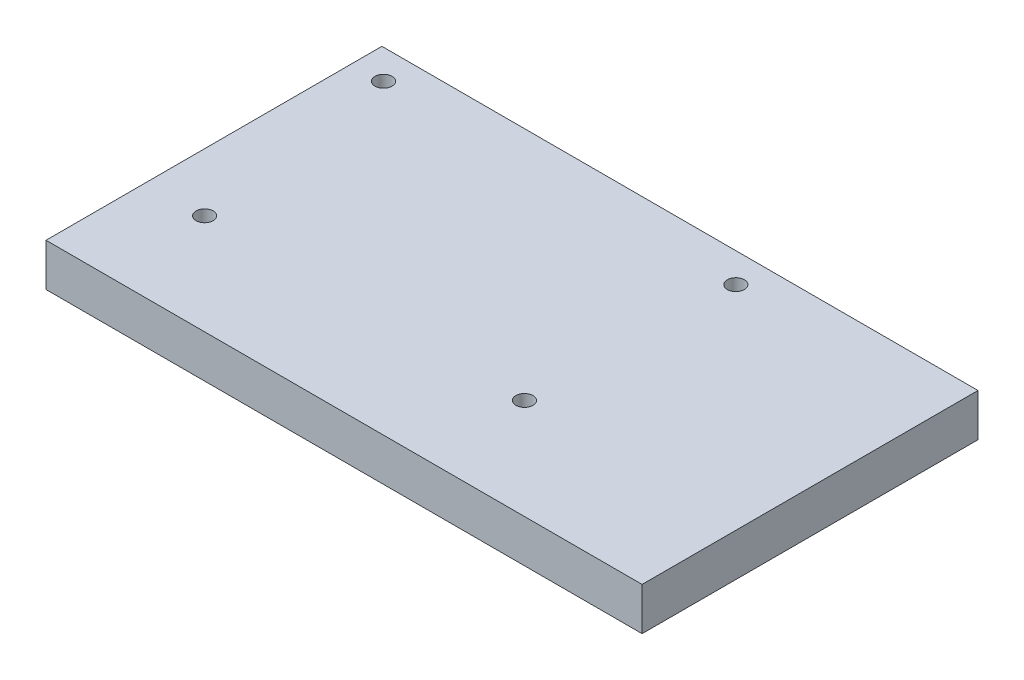
ISO-10303-21;
HEADER;
FILE_DESCRIPTION(('STEP AP214'),'2;1');
FILE_NAME('part.step','',(''),(''),'','','');
FILE_SCHEMA(('AUTOMOTIVE_DESIGN { 1 0 10303 214 1 1 1 1 }'));
ENDSEC;
DATA;
#1=APPLICATION_CONTEXT('core data for automotive mechanical design processes');
#2=APPLICATION_PROTOCOL_DEFINITION('international standard','automotive_design',2000,#1);
#3=PRODUCT_CONTEXT('',#1,'mechanical');
#4=PRODUCT('Part','Part','',(#3));
#5=PRODUCT_RELATED_PRODUCT_CATEGORY('part','',(#4));
#6=PRODUCT_DEFINITION_FORMATION('','',#4);
#7=PRODUCT_DEFINITION_CONTEXT('part definition',#1,'design');
#8=PRODUCT_DEFINITION('design','',#6,#7);
#9=PRODUCT_DEFINITION_SHAPE('','',#8);
#10=(LENGTH_UNIT() NAMED_UNIT(*) SI_UNIT(.MILLI.,.METRE.));
#11=(NAMED_UNIT(*) PLANE_ANGLE_UNIT() SI_UNIT($,.RADIAN.));
#12=(NAMED_UNIT(*) SI_UNIT($,.STERADIAN.) SOLID_ANGLE_UNIT());
#13=UNCERTAINTY_MEASURE_WITH_UNIT(LENGTH_MEASURE(1.E-05),#10,'distance_accuracy_value','');
#14=(GEOMETRIC_REPRESENTATION_CONTEXT(3) GLOBAL_UNCERTAINTY_ASSIGNED_CONTEXT((#13)) GLOBAL_UNIT_ASSIGNED_CONTEXT((#10,
#11,#12)) REPRESENTATION_CONTEXT('',''));
#15=CARTESIAN_POINT('',(0.,0.,0.));
#16=DIRECTION('',(0.,0.,1.));
#17=DIRECTION('',(1.,0.,0.));
#18=AXIS2_PLACEMENT_3D('',#15,#16,#17);
#19=CARTESIAN_POINT('',(0.,10.,0.));
#20=DIRECTION('',(1.,0.,0.));
#21=DIRECTION('',(0.,0.,-1.));
#22=AXIS2_PLACEMENT_3D('',#19,#20,#21);
#23=PLANE('',#22);
#24=DIRECTION('',(0.,0.,1.));
#25=VECTOR('',#24,1.);
#26=CARTESIAN_POINT('',(0.,0.,0.));
#27=LINE('',#26,#25);
#28=CARTESIAN_POINT('',(0.,0.,0.));
#29=VERTEX_POINT('',#28);
#30=CARTESIAN_POINT('',(0.,0.,78.7062484183639));
#31=VERTEX_POINT('',#30);
#32=EDGE_CURVE('E96',#29,#31,#27,.T.);
#33=ORIENTED_EDGE('',*,*,#32,.T.);
#34=DIRECTION('',(0.,-1.,0.));
#35=VECTOR('',#34,1.);
#36=CARTESIAN_POINT('',(0.,10.,78.7062484183639));
#37=LINE('',#36,#35);
#38=CARTESIAN_POINT('',(0.,10.,78.7062484183639));
#39=VERTEX_POINT('',#38);
#40=EDGE_CURVE('E11',#39,#31,#37,.T.);
#41=ORIENTED_EDGE('',*,*,#40,.F.);
#42=DIRECTION('',(0.,0.,1.));
#43=VECTOR('',#42,1.);
#44=CARTESIAN_POINT('',(0.,10.,0.));
#45=LINE('',#44,#43);
#46=CARTESIAN_POINT('',(0.,10.,0.));
#47=VERTEX_POINT('',#46);
#48=EDGE_CURVE('E84',#47,#39,#45,.T.);
#49=ORIENTED_EDGE('',*,*,#48,.F.);
#50=DIRECTION('',(0.,-1.,0.));
#51=VECTOR('',#50,1.);
#52=CARTESIAN_POINT('',(0.,10.,0.));
#53=LINE('',#52,#51);
#54=EDGE_CURVE('E92',#47,#29,#53,.T.);
#55=ORIENTED_EDGE('',*,*,#54,.T.);
#56=EDGE_LOOP('',(#33,#41,#49,#55));
#57=FACE_BOUND('',#56,.T.);
#58=ADVANCED_FACE('F33',(#57),#23,.F.);
#59=CARTESIAN_POINT('',(0.,10.,78.7062484183639));
#60=DIRECTION('',(0.,0.,-1.));
#61=DIRECTION('',(-1.,0.,0.));
#62=AXIS2_PLACEMENT_3D('',#59,#60,#61);
#63=PLANE('',#62);
#64=DIRECTION('',(1.,0.,0.));
#65=VECTOR('',#64,1.);
#66=CARTESIAN_POINT('',(0.,0.,78.7062484183639));
#67=LINE('',#66,#65);
#68=CARTESIAN_POINT('',(139.668592666269,0.,78.7062484183639));
#69=VERTEX_POINT('',#68);
#70=EDGE_CURVE('E88',#31,#69,#67,.T.);
#71=ORIENTED_EDGE('',*,*,#70,.T.);
#72=DIRECTION('',(0.,-1.,0.));
#73=VECTOR('',#72,1.);
#74=CARTESIAN_POINT('',(139.668592666269,10.,78.7062484183639));
#75=LINE('',#74,#73);
#76=CARTESIAN_POINT('',(139.668592666269,10.,78.7062484183639));
#77=VERTEX_POINT('',#76);
#78=EDGE_CURVE('E41',#77,#69,#75,.T.);
#79=ORIENTED_EDGE('',*,*,#78,.F.);
#80=DIRECTION('',(1.,0.,0.));
#81=VECTOR('',#80,1.);
#82=CARTESIAN_POINT('',(0.,10.,78.7062484183639));
#83=LINE('',#82,#81);
#84=EDGE_CURVE('E79',#39,#77,#83,.T.);
#85=ORIENTED_EDGE('',*,*,#84,.F.);
#86=ORIENTED_EDGE('',*,*,#40,.T.);
#87=EDGE_LOOP('',(#71,#79,#85,#86));
#88=FACE_BOUND('',#87,.T.);
#89=ADVANCED_FACE('F87',(#88),#63,.F.);
#90=CARTESIAN_POINT('',(139.668592666269,10.,0.));
#91=DIRECTION('',(-1.,0.,0.));
#92=DIRECTION('',(0.,0.,1.));
#93=AXIS2_PLACEMENT_3D('',#90,#91,#92);
#94=PLANE('',#93);
#95=DIRECTION('',(0.,0.,-1.));
#96=VECTOR('',#95,1.);
#97=CARTESIAN_POINT('',(139.668592666269,0.,0.));
#98=LINE('',#97,#96);
#99=CARTESIAN_POINT('',(139.668592666269,0.,0.));
#100=VERTEX_POINT('',#99);
#101=EDGE_CURVE('E66',#69,#100,#98,.T.);
#102=ORIENTED_EDGE('',*,*,#101,.T.);
#103=DIRECTION('',(0.,-1.,0.));
#104=VECTOR('',#103,1.);
#105=CARTESIAN_POINT('',(139.668592666269,10.,0.));
#106=LINE('',#105,#104);
#107=CARTESIAN_POINT('',(139.668592666269,10.,0.));
#108=VERTEX_POINT('',#107);
#109=EDGE_CURVE('E89',#108,#100,#106,.T.);
#110=ORIENTED_EDGE('',*,*,#109,.F.);
#111=DIRECTION('',(0.,0.,-1.));
#112=VECTOR('',#111,1.);
#113=CARTESIAN_POINT('',(139.668592666269,10.,0.));
#114=LINE('',#113,#112);
#115=EDGE_CURVE('E82',#77,#108,#114,.T.);
#116=ORIENTED_EDGE('',*,*,#115,.F.);
#117=ORIENTED_EDGE('',*,*,#78,.T.);
#118=EDGE_LOOP('',(#102,#110,#116,#117));
#119=FACE_BOUND('',#118,.T.);
#120=ADVANCED_FACE('F90',(#119),#94,.F.);
#121=CARTESIAN_POINT('',(0.,10.,0.));
#122=DIRECTION('',(0.,0.,1.));
#123=DIRECTION('',(1.,0.,0.));
#124=AXIS2_PLACEMENT_3D('',#121,#122,#123);
#125=PLANE('',#124);
#126=DIRECTION('',(-1.,0.,0.));
#127=VECTOR('',#126,1.);
#128=CARTESIAN_POINT('',(0.,0.,0.));
#129=LINE('',#128,#127);
#130=EDGE_CURVE('E72',#100,#29,#129,.T.);
#131=ORIENTED_EDGE('',*,*,#130,.T.);
#132=ORIENTED_EDGE('',*,*,#54,.F.);
#133=DIRECTION('',(-1.,0.,0.));
#134=VECTOR('',#133,1.);
#135=CARTESIAN_POINT('',(0.,10.,0.));
#136=LINE('',#135,#134);
#137=EDGE_CURVE('E49',#108,#47,#136,.T.);
#138=ORIENTED_EDGE('',*,*,#137,.F.);
#139=ORIENTED_EDGE('',*,*,#109,.T.);
#140=EDGE_LOOP('',(#131,#132,#138,#139));
#141=FACE_BOUND('',#140,.T.);
#142=ADVANCED_FACE('F104',(#141),#125,.F.);
#143=CARTESIAN_POINT('',(0.,10.,0.));
#144=DIRECTION('',(0.,1.,0.));
#145=DIRECTION('',(0.,0.,1.));
#146=AXIS2_PLACEMENT_3D('',#143,#144,#145);
#147=PLANE('',#146);
#148=CARTESIAN_POINT('',(7.27646870124331,10.,6.90123816471835));
#149=DIRECTION('',(0.,1.,0.));
#150=DIRECTION('',(0.,0.,1.));
#151=AXIS2_PLACEMENT_3D('',#148,#149,#150);
#152=CIRCLE('',#151,2.);
#153=CARTESIAN_POINT('',(7.27646870124331,10.,8.90123816471834));
#154=VERTEX_POINT('',#153);
#155=EDGE_CURVE('E119',#154,#154,#152,.T.);
#156=ORIENTED_EDGE('',*,*,#155,.F.);
#157=EDGE_LOOP('',(#156));
#158=FACE_BOUND('',#157,.T.);
#159=CARTESIAN_POINT('',(13.6264687012438,10.,55.161238164718));
#160=DIRECTION('',(0.,1.,0.));
#161=DIRECTION('',(0.,0.,1.));
#162=AXIS2_PLACEMENT_3D('',#159,#160,#161);
#163=CIRCLE('',#162,2.00000000000003);
#164=CARTESIAN_POINT('',(13.6264687012438,10.,57.161238164718));
#165=VERTEX_POINT('',#164);
#166=EDGE_CURVE('E125',#165,#165,#163,.T.);
#167=ORIENTED_EDGE('',*,*,#166,.F.);
#168=EDGE_LOOP('',(#167));
#169=FACE_BOUND('',#168,.T.);
#170=CARTESIAN_POINT('',(89.8264687012433,10.,6.90123816471834));
#171=DIRECTION('',(0.,1.,0.));
#172=DIRECTION('',(0.,0.,1.));
#173=AXIS2_PLACEMENT_3D('',#170,#171,#172);
#174=CIRCLE('',#173,2.00000000000001);
#175=CARTESIAN_POINT('',(89.8264687012433,10.,8.90123816471835));
#176=VERTEX_POINT('',#175);
#177=EDGE_CURVE('E113',#176,#176,#174,.T.);
#178=ORIENTED_EDGE('',*,*,#177,.F.);
#179=EDGE_LOOP('',(#178));
#180=FACE_BOUND('',#179,.T.);
#181=CARTESIAN_POINT('',(88.5564687012438,10.,55.161238164718));
#182=DIRECTION('',(0.,1.,0.));
#183=DIRECTION('',(0.,0.,1.));
#184=AXIS2_PLACEMENT_3D('',#181,#182,#183);
#185=CIRCLE('',#184,2.);
#186=CARTESIAN_POINT('',(88.5564687012438,10.,57.161238164718));
#187=VERTEX_POINT('',#186);
#188=EDGE_CURVE('E99',#187,#187,#185,.T.);
#189=ORIENTED_EDGE('',*,*,#188,.F.);
#190=EDGE_LOOP('',(#189));
#191=FACE_BOUND('',#190,.T.);
#192=ORIENTED_EDGE('',*,*,#48,.T.);
#193=ORIENTED_EDGE('',*,*,#84,.T.);
#194=ORIENTED_EDGE('',*,*,#115,.T.);
#195=ORIENTED_EDGE('',*,*,#137,.T.);
#196=EDGE_LOOP('',(#192,#193,#194,#195));
#197=FACE_BOUND('',#196,.T.);
#198=ADVANCED_FACE('F80',(#158,#169,#180,#191,#197),#147,.T.);
#199=CARTESIAN_POINT('',(0.,0.,0.));
#200=DIRECTION('',(0.,1.,0.));
#201=DIRECTION('',(0.,0.,1.));
#202=AXIS2_PLACEMENT_3D('',#199,#200,#201);
#203=PLANE('',#202);
#204=CARTESIAN_POINT('',(7.27646870124331,0.,6.90123816471835));
#205=DIRECTION('',(0.,1.,0.));
#206=DIRECTION('',(0.,0.,1.));
#207=AXIS2_PLACEMENT_3D('',#204,#205,#206);
#208=CIRCLE('',#207,2.);
#209=CARTESIAN_POINT('',(7.27646870124331,0.,8.90123816471834));
#210=VERTEX_POINT('',#209);
#211=EDGE_CURVE('E116',#210,#210,#208,.T.);
#212=ORIENTED_EDGE('',*,*,#211,.T.);
#213=EDGE_LOOP('',(#212));
#214=FACE_BOUND('',#213,.T.);
#215=CARTESIAN_POINT('',(13.6264687012438,0.,55.161238164718));
#216=DIRECTION('',(0.,1.,0.));
#217=DIRECTION('',(0.,0.,1.));
#218=AXIS2_PLACEMENT_3D('',#215,#216,#217);
#219=CIRCLE('',#218,2.00000000000003);
#220=CARTESIAN_POINT('',(13.6264687012438,0.,57.161238164718));
#221=VERTEX_POINT('',#220);
#222=EDGE_CURVE('E122',#221,#221,#219,.T.);
#223=ORIENTED_EDGE('',*,*,#222,.T.);
#224=EDGE_LOOP('',(#223));
#225=FACE_BOUND('',#224,.T.);
#226=CARTESIAN_POINT('',(89.8264687012433,0.,6.90123816471834));
#227=DIRECTION('',(0.,1.,0.));
#228=DIRECTION('',(0.,0.,1.));
#229=AXIS2_PLACEMENT_3D('',#226,#227,#228);
#230=CIRCLE('',#229,2.00000000000001);
#231=CARTESIAN_POINT('',(89.8264687012433,0.,8.90123816471835));
#232=VERTEX_POINT('',#231);
#233=EDGE_CURVE('E128',#232,#232,#230,.T.);
#234=ORIENTED_EDGE('',*,*,#233,.T.);
#235=EDGE_LOOP('',(#234));
#236=FACE_BOUND('',#235,.T.);
#237=CARTESIAN_POINT('',(88.5564687012438,0.,55.161238164718));
#238=DIRECTION('',(0.,1.,0.));
#239=DIRECTION('',(0.,0.,1.));
#240=AXIS2_PLACEMENT_3D('',#237,#238,#239);
#241=CIRCLE('',#240,2.);
#242=CARTESIAN_POINT('',(88.5564687012438,0.,57.161238164718));
#243=VERTEX_POINT('',#242);
#244=EDGE_CURVE('E110',#243,#243,#241,.T.);
#245=ORIENTED_EDGE('',*,*,#244,.T.);
#246=EDGE_LOOP('',(#245));
#247=FACE_BOUND('',#246,.T.);
#248=ORIENTED_EDGE('',*,*,#32,.F.);
#249=ORIENTED_EDGE('',*,*,#130,.F.);
#250=ORIENTED_EDGE('',*,*,#101,.F.);
#251=ORIENTED_EDGE('',*,*,#70,.F.);
#252=EDGE_LOOP('',(#248,#249,#250,#251));
#253=FACE_BOUND('',#252,.T.);
#254=ADVANCED_FACE('F107',(#214,#225,#236,#247,#253),#203,.F.);
#255=CARTESIAN_POINT('',(88.5564687012438,10.,55.161238164718));
#256=DIRECTION('',(0.,-1.,0.));
#257=DIRECTION('',(0.,0.,-1.));
#258=AXIS2_PLACEMENT_3D('',#255,#256,#257);
#259=CYLINDRICAL_SURFACE('',#258,2.);
#260=ORIENTED_EDGE('',*,*,#188,.T.);
#261=EDGE_LOOP('',(#260));
#262=FACE_BOUND('',#261,.T.);
#263=ORIENTED_EDGE('',*,*,#244,.F.);
#264=EDGE_LOOP('',(#263));
#265=FACE_BOUND('',#264,.T.);
#266=ADVANCED_FACE('F143',(#262,#265),#259,.F.);
#267=CARTESIAN_POINT('',(89.8264687012433,10.,6.90123816471834));
#268=DIRECTION('',(0.,-1.,0.));
#269=DIRECTION('',(0.,0.,-1.));
#270=AXIS2_PLACEMENT_3D('',#267,#268,#269);
#271=CYLINDRICAL_SURFACE('',#270,2.00000000000001);
#272=ORIENTED_EDGE('',*,*,#177,.T.);
#273=EDGE_LOOP('',(#272));
#274=FACE_BOUND('',#273,.T.);
#275=ORIENTED_EDGE('',*,*,#233,.F.);
#276=EDGE_LOOP('',(#275));
#277=FACE_BOUND('',#276,.T.);
#278=ADVANCED_FACE('F134',(#274,#277),#271,.F.);
#279=CARTESIAN_POINT('',(13.6264687012438,10.,55.161238164718));
#280=DIRECTION('',(0.,-1.,0.));
#281=DIRECTION('',(0.,0.,-1.));
#282=AXIS2_PLACEMENT_3D('',#279,#280,#281);
#283=CYLINDRICAL_SURFACE('',#282,2.00000000000003);
#284=ORIENTED_EDGE('',*,*,#166,.T.);
#285=EDGE_LOOP('',(#284));
#286=FACE_BOUND('',#285,.T.);
#287=ORIENTED_EDGE('',*,*,#222,.F.);
#288=EDGE_LOOP('',(#287));
#289=FACE_BOUND('',#288,.T.);
#290=ADVANCED_FACE('F192',(#286,#289),#283,.F.);
#291=CARTESIAN_POINT('',(7.27646870124331,10.,6.90123816471835));
#292=DIRECTION('',(0.,-1.,0.));
#293=DIRECTION('',(0.,0.,-1.));
#294=AXIS2_PLACEMENT_3D('',#291,#292,#293);
#295=CYLINDRICAL_SURFACE('',#294,2.);
#296=ORIENTED_EDGE('',*,*,#155,.T.);
#297=EDGE_LOOP('',(#296));
#298=FACE_BOUND('',#297,.T.);
#299=ORIENTED_EDGE('',*,*,#211,.F.);
#300=EDGE_LOOP('',(#299));
#301=FACE_BOUND('',#300,.T.);
#302=ADVANCED_FACE('F201',(#298,#301),#295,.F.);
#303=CLOSED_SHELL('',(#58,#89,#120,#142,#198,#254,#266,#278,#290,#302));
#304=MANIFOLD_SOLID_BREP('B2',#303);
#305=ADVANCED_BREP_SHAPE_REPRESENTATION('',(#18,#304),#14);
#306=SHAPE_DEFINITION_REPRESENTATION(#9,#305);
ENDSEC;
END-ISO-10303-21;
